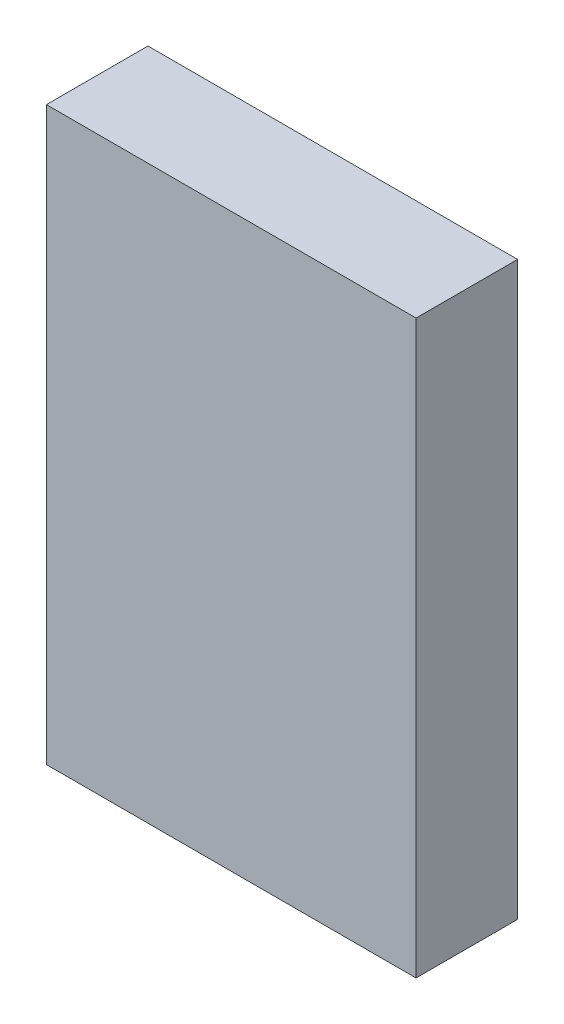
ISO-10303-21;
HEADER;
FILE_DESCRIPTION(('STEP AP214'),'2;1');
FILE_NAME('part.step','',(''),(''),'','','');
FILE_SCHEMA(('AUTOMOTIVE_DESIGN { 1 0 10303 214 1 1 1 1 }'));
ENDSEC;
DATA;
#1=APPLICATION_CONTEXT('core data for automotive mechanical design processes');
#2=APPLICATION_PROTOCOL_DEFINITION('international standard','automotive_design',2000,#1);
#3=PRODUCT_CONTEXT('',#1,'mechanical');
#4=PRODUCT('Part','Part','',(#3));
#5=PRODUCT_RELATED_PRODUCT_CATEGORY('part','',(#4));
#6=PRODUCT_DEFINITION_FORMATION('','',#4);
#7=PRODUCT_DEFINITION_CONTEXT('part definition',#1,'design');
#8=PRODUCT_DEFINITION('design','',#6,#7);
#9=PRODUCT_DEFINITION_SHAPE('','',#8);
#10=(LENGTH_UNIT() NAMED_UNIT(*) SI_UNIT(.MILLI.,.METRE.));
#11=(NAMED_UNIT(*) PLANE_ANGLE_UNIT() SI_UNIT($,.RADIAN.));
#12=(NAMED_UNIT(*) SI_UNIT($,.STERADIAN.) SOLID_ANGLE_UNIT());
#13=UNCERTAINTY_MEASURE_WITH_UNIT(LENGTH_MEASURE(1.E-05),#10,'distance_accuracy_value','');
#14=(GEOMETRIC_REPRESENTATION_CONTEXT(3) GLOBAL_UNCERTAINTY_ASSIGNED_CONTEXT((#13)) GLOBAL_UNIT_ASSIGNED_CONTEXT((#10,
#11,#12)) REPRESENTATION_CONTEXT('',''));
#15=CARTESIAN_POINT('',(0.,0.,0.));
#16=DIRECTION('',(0.,0.,1.));
#17=DIRECTION('',(1.,0.,0.));
#18=AXIS2_PLACEMENT_3D('',#15,#16,#17);
#19=CARTESIAN_POINT('',(-43.94,67.945,24.14));
#20=DIRECTION('',(1.,0.,0.));
#21=DIRECTION('',(0.,1.,0.));
#22=AXIS2_PLACEMENT_3D('',#19,#20,#21);
#23=PLANE('',#22);
#24=DIRECTION('',(0.,-1.,0.));
#25=VECTOR('',#24,1.);
#26=CARTESIAN_POINT('',(-43.94,67.945,0.));
#27=LINE('',#26,#25);
#28=CARTESIAN_POINT('',(-43.94,67.945,0.));
#29=VERTEX_POINT('',#28);
#30=CARTESIAN_POINT('',(-43.94,-67.945,0.));
#31=VERTEX_POINT('',#30);
#32=EDGE_CURVE('E100',#29,#31,#27,.T.);
#33=ORIENTED_EDGE('',*,*,#32,.T.);
#34=DIRECTION('',(0.,0.,-1.));
#35=VECTOR('',#34,1.);
#36=CARTESIAN_POINT('',(-43.94,-67.945,24.14));
#37=LINE('',#36,#35);
#38=CARTESIAN_POINT('',(-43.94,-67.945,24.14));
#39=VERTEX_POINT('',#38);
#40=EDGE_CURVE('E11',#39,#31,#37,.T.);
#41=ORIENTED_EDGE('',*,*,#40,.F.);
#42=DIRECTION('',(0.,-1.,0.));
#43=VECTOR('',#42,1.);
#44=CARTESIAN_POINT('',(-43.94,67.945,24.14));
#45=LINE('',#44,#43);
#46=CARTESIAN_POINT('',(-43.94,67.945,24.14));
#47=VERTEX_POINT('',#46);
#48=EDGE_CURVE('E88',#47,#39,#45,.T.);
#49=ORIENTED_EDGE('',*,*,#48,.F.);
#50=DIRECTION('',(0.,0.,-1.));
#51=VECTOR('',#50,1.);
#52=CARTESIAN_POINT('',(-43.94,67.945,24.14));
#53=LINE('',#52,#51);
#54=EDGE_CURVE('E96',#47,#29,#53,.T.);
#55=ORIENTED_EDGE('',*,*,#54,.T.);
#56=EDGE_LOOP('',(#33,#41,#49,#55));
#57=FACE_BOUND('',#56,.T.);
#58=ADVANCED_FACE('F37',(#57),#23,.F.);
#59=CARTESIAN_POINT('',(43.94,-67.945,24.14));
#60=DIRECTION('',(0.,1.,0.));
#61=DIRECTION('',(0.,0.,1.));
#62=AXIS2_PLACEMENT_3D('',#59,#60,#61);
#63=PLANE('',#62);
#64=DIRECTION('',(1.,0.,0.));
#65=VECTOR('',#64,1.);
#66=CARTESIAN_POINT('',(43.94,-67.945,0.));
#67=LINE('',#66,#65);
#68=CARTESIAN_POINT('',(43.94,-67.945,0.));
#69=VERTEX_POINT('',#68);
#70=EDGE_CURVE('E92',#31,#69,#67,.T.);
#71=ORIENTED_EDGE('',*,*,#70,.T.);
#72=DIRECTION('',(0.,0.,-1.));
#73=VECTOR('',#72,1.);
#74=CARTESIAN_POINT('',(43.94,-67.945,24.14));
#75=LINE('',#74,#73);
#76=CARTESIAN_POINT('',(43.94,-67.945,24.14));
#77=VERTEX_POINT('',#76);
#78=EDGE_CURVE('E45',#77,#69,#75,.T.);
#79=ORIENTED_EDGE('',*,*,#78,.F.);
#80=DIRECTION('',(1.,0.,0.));
#81=VECTOR('',#80,1.);
#82=CARTESIAN_POINT('',(43.94,-67.945,24.14));
#83=LINE('',#82,#81);
#84=EDGE_CURVE('E83',#39,#77,#83,.T.);
#85=ORIENTED_EDGE('',*,*,#84,.F.);
#86=ORIENTED_EDGE('',*,*,#40,.T.);
#87=EDGE_LOOP('',(#71,#79,#85,#86));
#88=FACE_BOUND('',#87,.T.);
#89=ADVANCED_FACE('F91',(#88),#63,.F.);
#90=CARTESIAN_POINT('',(43.94,67.945,24.14));
#91=DIRECTION('',(-1.,0.,0.));
#92=DIRECTION('',(0.,-1.,0.));
#93=AXIS2_PLACEMENT_3D('',#90,#91,#92);
#94=PLANE('',#93);
#95=DIRECTION('',(0.,1.,0.));
#96=VECTOR('',#95,1.);
#97=CARTESIAN_POINT('',(43.94,67.945,0.));
#98=LINE('',#97,#96);
#99=CARTESIAN_POINT('',(43.94,67.945,0.));
#100=VERTEX_POINT('',#99);
#101=EDGE_CURVE('E70',#69,#100,#98,.T.);
#102=ORIENTED_EDGE('',*,*,#101,.T.);
#103=DIRECTION('',(0.,0.,-1.));
#104=VECTOR('',#103,1.);
#105=CARTESIAN_POINT('',(43.94,67.945,24.14));
#106=LINE('',#105,#104);
#107=CARTESIAN_POINT('',(43.94,67.945,24.14));
#108=VERTEX_POINT('',#107);
#109=EDGE_CURVE('E93',#108,#100,#106,.T.);
#110=ORIENTED_EDGE('',*,*,#109,.F.);
#111=DIRECTION('',(0.,1.,0.));
#112=VECTOR('',#111,1.);
#113=CARTESIAN_POINT('',(43.94,67.945,24.14));
#114=LINE('',#113,#112);
#115=EDGE_CURVE('E86',#77,#108,#114,.T.);
#116=ORIENTED_EDGE('',*,*,#115,.F.);
#117=ORIENTED_EDGE('',*,*,#78,.T.);
#118=EDGE_LOOP('',(#102,#110,#116,#117));
#119=FACE_BOUND('',#118,.T.);
#120=ADVANCED_FACE('F94',(#119),#94,.F.);
#121=CARTESIAN_POINT('',(43.94,67.945,24.14));
#122=DIRECTION('',(0.,-1.,0.));
#123=DIRECTION('',(0.,0.,-1.));
#124=AXIS2_PLACEMENT_3D('',#121,#122,#123);
#125=PLANE('',#124);
#126=DIRECTION('',(-1.,0.,0.));
#127=VECTOR('',#126,1.);
#128=CARTESIAN_POINT('',(43.94,67.945,0.));
#129=LINE('',#128,#127);
#130=EDGE_CURVE('E76',#100,#29,#129,.T.);
#131=ORIENTED_EDGE('',*,*,#130,.T.);
#132=ORIENTED_EDGE('',*,*,#54,.F.);
#133=DIRECTION('',(-1.,0.,0.));
#134=VECTOR('',#133,1.);
#135=CARTESIAN_POINT('',(43.94,67.945,24.14));
#136=LINE('',#135,#134);
#137=EDGE_CURVE('E53',#108,#47,#136,.T.);
#138=ORIENTED_EDGE('',*,*,#137,.F.);
#139=ORIENTED_EDGE('',*,*,#109,.T.);
#140=EDGE_LOOP('',(#131,#132,#138,#139));
#141=FACE_BOUND('',#140,.T.);
#142=ADVANCED_FACE('F107',(#141),#125,.F.);
#143=CARTESIAN_POINT('',(0.,0.,24.14));
#144=DIRECTION('',(0.,0.,-1.));
#145=DIRECTION('',(-1.,0.,0.));
#146=AXIS2_PLACEMENT_3D('',#143,#144,#145);
#147=PLANE('',#146);
#148=ORIENTED_EDGE('',*,*,#48,.T.);
#149=ORIENTED_EDGE('',*,*,#84,.T.);
#150=ORIENTED_EDGE('',*,*,#115,.T.);
#151=ORIENTED_EDGE('',*,*,#137,.T.);
#152=EDGE_LOOP('',(#148,#149,#150,#151));
#153=FACE_BOUND('',#152,.T.);
#154=ADVANCED_FACE('F84',(#153),#147,.F.);
#155=CARTESIAN_POINT('',(0.,0.,0.));
#156=DIRECTION('',(0.,0.,-1.));
#157=DIRECTION('',(-1.,0.,0.));
#158=AXIS2_PLACEMENT_3D('',#155,#156,#157);
#159=PLANE('',#158);
#160=ORIENTED_EDGE('',*,*,#32,.F.);
#161=ORIENTED_EDGE('',*,*,#130,.F.);
#162=ORIENTED_EDGE('',*,*,#101,.F.);
#163=ORIENTED_EDGE('',*,*,#70,.F.);
#164=EDGE_LOOP('',(#160,#161,#162,#163));
#165=FACE_BOUND('',#164,.T.);
#166=ADVANCED_FACE('F110',(#165),#159,.T.);
#167=CLOSED_SHELL('',(#58,#89,#120,#142,#154,#166));
#168=MANIFOLD_SOLID_BREP('B2',#167);
#169=ADVANCED_BREP_SHAPE_REPRESENTATION('',(#18,#168),#14);
#170=SHAPE_DEFINITION_REPRESENTATION(#9,#169);
ENDSEC;
END-ISO-10303-21;
